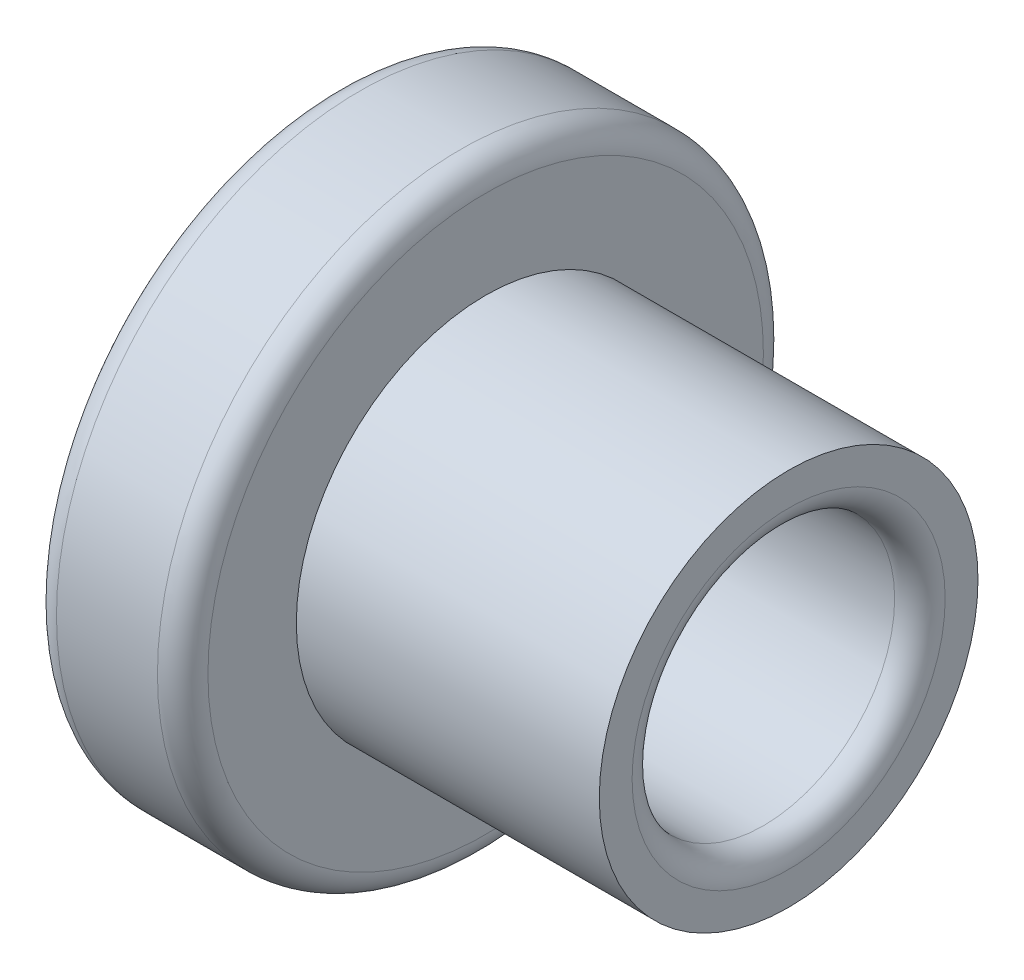
ISO-10303-21;
HEADER;
FILE_DESCRIPTION(('STEP AP214'),'2;1');
FILE_NAME('part.step','',(''),(''),'','','');
FILE_SCHEMA(('AUTOMOTIVE_DESIGN { 1 0 10303 214 1 1 1 1 }'));
ENDSEC;
DATA;
#1=APPLICATION_CONTEXT('core data for automotive mechanical design processes');
#2=APPLICATION_PROTOCOL_DEFINITION('international standard','automotive_design',2000,#1);
#3=PRODUCT_CONTEXT('',#1,'mechanical');
#4=PRODUCT('Part','Part','',(#3));
#5=PRODUCT_RELATED_PRODUCT_CATEGORY('part','',(#4));
#6=PRODUCT_DEFINITION_FORMATION('','',#4);
#7=PRODUCT_DEFINITION_CONTEXT('part definition',#1,'design');
#8=PRODUCT_DEFINITION('design','',#6,#7);
#9=PRODUCT_DEFINITION_SHAPE('','',#8);
#10=(LENGTH_UNIT() NAMED_UNIT(*) SI_UNIT(.MILLI.,.METRE.));
#11=(NAMED_UNIT(*) PLANE_ANGLE_UNIT() SI_UNIT($,.RADIAN.));
#12=(NAMED_UNIT(*) SI_UNIT($,.STERADIAN.) SOLID_ANGLE_UNIT());
#13=UNCERTAINTY_MEASURE_WITH_UNIT(LENGTH_MEASURE(1.E-05),#10,'distance_accuracy_value','');
#14=(GEOMETRIC_REPRESENTATION_CONTEXT(3) GLOBAL_UNCERTAINTY_ASSIGNED_CONTEXT((#13)) GLOBAL_UNIT_ASSIGNED_CONTEXT((#10,
#11,#12)) REPRESENTATION_CONTEXT('',''));
#15=CARTESIAN_POINT('',(0.,0.,0.));
#16=DIRECTION('',(0.,0.,1.));
#17=DIRECTION('',(1.,0.,0.));
#18=AXIS2_PLACEMENT_3D('',#15,#16,#17);
#19=CARTESIAN_POINT('',(3.81,0.,0.));
#20=DIRECTION('',(-1.,0.,0.));
#21=DIRECTION('',(0.,0.,1.));
#22=AXIS2_PLACEMENT_3D('',#19,#20,#21);
#23=CYLINDRICAL_SURFACE('',#22,3.302);
#24=CARTESIAN_POINT('',(10.795,0.,0.));
#25=DIRECTION('',(1.,0.,0.));
#26=DIRECTION('',(0.,0.,-1.));
#27=AXIS2_PLACEMENT_3D('',#24,#25,#26);
#28=CIRCLE('',#27,3.302);
#29=CARTESIAN_POINT('',(10.795,0.,3.302));
#30=VERTEX_POINT('',#29);
#31=EDGE_CURVE('E60',#30,#30,#28,.T.);
#32=CARTESIAN_POINT('',(3.175,0.,0.));
#33=DIRECTION('',(1.,0.,0.));
#34=DIRECTION('',(0.,0.,-1.));
#35=AXIS2_PLACEMENT_3D('',#32,#33,#34);
#36=CIRCLE('',#35,3.302);
#37=CARTESIAN_POINT('',(3.175,0.,3.302));
#38=VERTEX_POINT('',#37);
#39=EDGE_CURVE('E65',#38,#38,#36,.F.);
#40=CARTESIAN_POINT('',(10.795,0.,3.302));
#41=CARTESIAN_POINT('',(10.715625,0.,3.302));
#42=CARTESIAN_POINT('',(10.63625,0.,3.302));
#43=CARTESIAN_POINT('',(10.4775,0.,3.302));
#44=CARTESIAN_POINT('',(10.398125,0.,3.302));
#45=CARTESIAN_POINT('',(10.239375,0.,3.302));
#46=CARTESIAN_POINT('',(10.16,0.,3.302));
#47=CARTESIAN_POINT('',(10.00125,0.,3.302));
#48=CARTESIAN_POINT('',(9.921875,0.,3.302));
#49=CARTESIAN_POINT('',(9.763125,0.,3.302));
#50=CARTESIAN_POINT('',(9.68375,0.,3.302));
#51=CARTESIAN_POINT('',(9.525,0.,3.302));
#52=CARTESIAN_POINT('',(9.445625,0.,3.302));
#53=CARTESIAN_POINT('',(9.286875,0.,3.302));
#54=CARTESIAN_POINT('',(9.2075,0.,3.302));
#55=CARTESIAN_POINT('',(9.04875,0.,3.302));
#56=CARTESIAN_POINT('',(8.969375,0.,3.302));
#57=CARTESIAN_POINT('',(8.810625,0.,3.302));
#58=CARTESIAN_POINT('',(8.73125,0.,3.302));
#59=CARTESIAN_POINT('',(8.5725,0.,3.302));
#60=CARTESIAN_POINT('',(8.493125,0.,3.302));
#61=CARTESIAN_POINT('',(8.334375,0.,3.302));
#62=CARTESIAN_POINT('',(8.255,0.,3.302));
#63=CARTESIAN_POINT('',(8.09625,0.,3.302));
#64=CARTESIAN_POINT('',(8.016875,0.,3.302));
#65=CARTESIAN_POINT('',(7.858125,0.,3.302));
#66=CARTESIAN_POINT('',(7.77875,0.,3.302));
#67=CARTESIAN_POINT('',(7.62,0.,3.302));
#68=CARTESIAN_POINT('',(7.540625,0.,3.302));
#69=CARTESIAN_POINT('',(7.381875,0.,3.302));
#70=CARTESIAN_POINT('',(7.3025,0.,3.302));
#71=CARTESIAN_POINT('',(7.14375,0.,3.302));
#72=CARTESIAN_POINT('',(7.064375,0.,3.302));
#73=CARTESIAN_POINT('',(6.905625,0.,3.302));
#74=CARTESIAN_POINT('',(6.82625,0.,3.302));
#75=CARTESIAN_POINT('',(6.6675,0.,3.302));
#76=CARTESIAN_POINT('',(6.588125,0.,3.302));
#77=CARTESIAN_POINT('',(6.429375,0.,3.302));
#78=CARTESIAN_POINT('',(6.35,0.,3.302));
#79=CARTESIAN_POINT('',(6.19125,0.,3.302));
#80=CARTESIAN_POINT('',(6.111875,0.,3.302));
#81=CARTESIAN_POINT('',(5.953125,0.,3.302));
#82=CARTESIAN_POINT('',(5.87375,0.,3.302));
#83=CARTESIAN_POINT('',(5.715,0.,3.302));
#84=CARTESIAN_POINT('',(5.635625,0.,3.302));
#85=CARTESIAN_POINT('',(5.476875,0.,3.302));
#86=CARTESIAN_POINT('',(5.3975,0.,3.302));
#87=CARTESIAN_POINT('',(5.23875,0.,3.302));
#88=CARTESIAN_POINT('',(5.159375,0.,3.302));
#89=CARTESIAN_POINT('',(5.000625,0.,3.302));
#90=CARTESIAN_POINT('',(4.92125,0.,3.302));
#91=CARTESIAN_POINT('',(4.7625,0.,3.302));
#92=CARTESIAN_POINT('',(4.683125,0.,3.302));
#93=CARTESIAN_POINT('',(4.524375,0.,3.302));
#94=CARTESIAN_POINT('',(4.445,0.,3.302));
#95=CARTESIAN_POINT('',(4.28625,0.,3.302));
#96=CARTESIAN_POINT('',(4.206875,0.,3.302));
#97=CARTESIAN_POINT('',(4.048125,0.,3.302));
#98=CARTESIAN_POINT('',(3.96875,0.,3.302));
#99=CARTESIAN_POINT('',(3.81,0.,3.302));
#100=CARTESIAN_POINT('',(3.730625,0.,3.302));
#101=CARTESIAN_POINT('',(3.571875,0.,3.302));
#102=CARTESIAN_POINT('',(3.4925,0.,3.302));
#103=CARTESIAN_POINT('',(3.33375,0.,3.302));
#104=CARTESIAN_POINT('',(3.254375,0.,3.302));
#105=CARTESIAN_POINT('',(3.175,0.,3.302));
#106=B_SPLINE_CURVE_WITH_KNOTS('',3,(#40,#41,#42,#43,#44,#45,#46,#47,#48,#49,#50,#51,#52,#53,
#54,#55,#56,#57,#58,#59,#60,#61,#62,#63,#64,#65,#66,#67,#68,#69,#70,#71,#72,#73,#74,#75,#76,#77,
#78,#79,#80,#81,#82,#83,#84,#85,#86,#87,#88,#89,#90,#91,#92,#93,#94,#95,#96,#97,#98,#99,#100,
#101,#102,#103,#104,#105),.UNSPECIFIED.,.F.,.F.,(4,2,2,2,2,2,2,2,2,2,2,2,2,2,2,2,2,2,2,2,2,2,2,
2,2,2,2,2,2,2,2,2,4),(0.,0.238125,0.476250000000001,0.714375,0.9525,1.190625,1.42875,1.666875,
1.905,2.143125,2.38125,2.619375,2.8575,3.095625,3.33375,3.571875,3.81,4.048125,4.28625,4.524375,
4.7625,5.000625,5.23875,5.476875,5.715,5.953125,6.19125,6.429375,6.6675,6.905625,7.14375,
7.381875,7.62),.UNSPECIFIED.);
#107=EDGE_CURVE('BSEAM52',#30,#38,#106,.T.);
#108=ORIENTED_EDGE('',*,*,#31,.T.);
#109=ORIENTED_EDGE('',*,*,#39,.T.);
#110=ORIENTED_EDGE('',*,*,#107,.T.);
#111=ORIENTED_EDGE('',*,*,#107,.F.);
#112=EDGE_LOOP('',(#108,#110,#109,#111));
#113=FACE_BOUND('',#112,.T.);
#114=ADVANCED_FACE('F52',(#113),#23,.F.);
#115=CARTESIAN_POINT('',(14.605,0.,0.));
#116=DIRECTION('',(-1.,0.,0.));
#117=DIRECTION('',(0.,0.,1.));
#118=AXIS2_PLACEMENT_3D('',#115,#116,#117);
#119=CYLINDRICAL_SURFACE('',#118,4.7625);
#120=CARTESIAN_POINT('',(3.81,0.,0.));
#121=DIRECTION('',(1.,0.,0.));
#122=DIRECTION('',(0.,0.,-1.));
#123=AXIS2_PLACEMENT_3D('',#120,#121,#122);
#124=CIRCLE('',#123,4.7625);
#125=CARTESIAN_POINT('',(3.81,0.,-4.7625));
#126=VERTEX_POINT('',#125);
#127=EDGE_CURVE('E92',#126,#126,#124,.T.);
#128=ORIENTED_EDGE('',*,*,#127,.T.);
#129=EDGE_LOOP('',(#128));
#130=FACE_BOUND('',#129,.T.);
#131=CARTESIAN_POINT('',(11.43,0.,0.));
#132=DIRECTION('',(1.,0.,0.));
#133=DIRECTION('',(0.,0.,-1.));
#134=AXIS2_PLACEMENT_3D('',#131,#132,#133);
#135=CIRCLE('',#134,4.7625);
#136=CARTESIAN_POINT('',(11.43,0.,-4.7625));
#137=VERTEX_POINT('',#136);
#138=EDGE_CURVE('E96',#137,#137,#135,.F.);
#139=ORIENTED_EDGE('',*,*,#138,.T.);
#140=EDGE_LOOP('',(#139));
#141=FACE_BOUND('',#140,.T.);
#142=ADVANCED_FACE('F101',(#130,#141),#119,.T.);
#143=CARTESIAN_POINT('',(3.81,0.,0.));
#144=DIRECTION('',(1.,0.,0.));
#145=DIRECTION('',(0.,0.,-1.));
#146=AXIS2_PLACEMENT_3D('',#143,#144,#145);
#147=PLANE('',#146);
#148=CARTESIAN_POINT('',(3.81,0.,0.));
#149=DIRECTION('',(1.,0.,0.));
#150=DIRECTION('',(0.,0.,-1.));
#151=AXIS2_PLACEMENT_3D('',#148,#149,#150);
#152=CIRCLE('',#151,6.985);
#153=CARTESIAN_POINT('',(3.81,0.,-6.985));
#154=VERTEX_POINT('',#153);
#155=EDGE_CURVE('E76',#154,#154,#152,.T.);
#156=ORIENTED_EDGE('',*,*,#155,.T.);
#157=EDGE_LOOP('',(#156));
#158=FACE_BOUND('',#157,.T.);
#159=ORIENTED_EDGE('',*,*,#127,.F.);
#160=EDGE_LOOP('',(#159));
#161=FACE_BOUND('',#160,.T.);
#162=ADVANCED_FACE('F120',(#158,#161),#147,.T.);
#163=CARTESIAN_POINT('',(0.,0.,0.));
#164=DIRECTION('',(1.,0.,0.));
#165=DIRECTION('',(0.,0.,-1.));
#166=AXIS2_PLACEMENT_3D('',#163,#164,#165);
#167=PLANE('',#166);
#168=CARTESIAN_POINT('',(0.,0.,0.));
#169=DIRECTION('',(1.,0.,0.));
#170=DIRECTION('',(0.,0.,-1.));
#171=AXIS2_PLACEMENT_3D('',#168,#169,#170);
#172=CIRCLE('',#171,6.9544196929267);
#173=CARTESIAN_POINT('',(0.,0.,-6.9544196929267));
#174=VERTEX_POINT('',#173);
#175=EDGE_CURVE('E70',#174,#174,#172,.T.);
#176=ORIENTED_EDGE('',*,*,#175,.T.);
#177=EDGE_LOOP('',(#176));
#178=FACE_BOUND('',#177,.T.);
#179=CARTESIAN_POINT('',(0.,0.,0.));
#180=DIRECTION('',(1.,0.,0.));
#181=DIRECTION('',(0.,0.,-1.));
#182=AXIS2_PLACEMENT_3D('',#179,#180,#181);
#183=CIRCLE('',#182,6.985);
#184=CARTESIAN_POINT('',(0.,0.,-6.985));
#185=VERTEX_POINT('',#184);
#186=EDGE_CURVE('E80',#185,#185,#183,.F.);
#187=ORIENTED_EDGE('',*,*,#186,.T.);
#188=EDGE_LOOP('',(#187));
#189=FACE_BOUND('',#188,.T.);
#190=ADVANCED_FACE('F126',(#178,#189),#167,.F.);
#191=CARTESIAN_POINT('',(3.81,0.,0.));
#192=DIRECTION('',(-1.,0.,0.));
#193=DIRECTION('',(0.,0.,1.));
#194=AXIS2_PLACEMENT_3D('',#191,#192,#193);
#195=CYLINDRICAL_SURFACE('',#194,7.62);
#196=CARTESIAN_POINT('',(0.635,0.,0.));
#197=DIRECTION('',(1.,0.,0.));
#198=DIRECTION('',(0.,0.,-1.));
#199=AXIS2_PLACEMENT_3D('',#196,#197,#198);
#200=CIRCLE('',#199,7.62);
#201=CARTESIAN_POINT('',(0.635,0.,7.62));
#202=VERTEX_POINT('',#201);
#203=EDGE_CURVE('E84',#202,#202,#200,.T.);
#204=CARTESIAN_POINT('',(3.175,0.,0.));
#205=DIRECTION('',(1.,0.,0.));
#206=DIRECTION('',(0.,0.,-1.));
#207=AXIS2_PLACEMENT_3D('',#204,#205,#206);
#208=CIRCLE('',#207,7.62);
#209=CARTESIAN_POINT('',(3.175,0.,7.62));
#210=VERTEX_POINT('',#209);
#211=EDGE_CURVE('E88',#210,#210,#208,.F.);
#212=CARTESIAN_POINT('',(0.635,0.,7.62));
#213=CARTESIAN_POINT('',(0.661458333333333,0.,7.62));
#214=CARTESIAN_POINT('',(0.687916666666667,0.,7.62));
#215=CARTESIAN_POINT('',(0.740833333333333,0.,7.62));
#216=CARTESIAN_POINT('',(0.767291666666667,0.,7.62));
#217=CARTESIAN_POINT('',(0.820208333333334,0.,7.62));
#218=CARTESIAN_POINT('',(0.846666666666667,0.,7.62));
#219=CARTESIAN_POINT('',(0.899583333333334,0.,7.62));
#220=CARTESIAN_POINT('',(0.926041666666667,0.,7.62));
#221=CARTESIAN_POINT('',(0.978958333333334,0.,7.62));
#222=CARTESIAN_POINT('',(1.00541666666667,0.,7.62));
#223=CARTESIAN_POINT('',(1.05833333333333,0.,7.62));
#224=CARTESIAN_POINT('',(1.08479166666667,0.,7.62));
#225=CARTESIAN_POINT('',(1.13770833333333,0.,7.62));
#226=CARTESIAN_POINT('',(1.16416666666667,0.,7.62));
#227=CARTESIAN_POINT('',(1.21708333333333,0.,7.62));
#228=CARTESIAN_POINT('',(1.24354166666667,0.,7.62));
#229=CARTESIAN_POINT('',(1.29645833333333,0.,7.62));
#230=CARTESIAN_POINT('',(1.32291666666667,0.,7.62));
#231=CARTESIAN_POINT('',(1.37583333333333,0.,7.62));
#232=CARTESIAN_POINT('',(1.40229166666667,0.,7.62));
#233=CARTESIAN_POINT('',(1.45520833333333,0.,7.62));
#234=CARTESIAN_POINT('',(1.48166666666667,0.,7.62));
#235=CARTESIAN_POINT('',(1.53458333333333,0.,7.62));
#236=CARTESIAN_POINT('',(1.56104166666667,0.,7.62));
#237=CARTESIAN_POINT('',(1.61395833333333,0.,7.62));
#238=CARTESIAN_POINT('',(1.64041666666667,0.,7.62));
#239=CARTESIAN_POINT('',(1.69333333333333,0.,7.62));
#240=CARTESIAN_POINT('',(1.71979166666667,0.,7.62));
#241=CARTESIAN_POINT('',(1.77270833333333,0.,7.62));
#242=CARTESIAN_POINT('',(1.79916666666667,0.,7.62));
#243=CARTESIAN_POINT('',(1.85208333333333,0.,7.62));
#244=CARTESIAN_POINT('',(1.87854166666667,0.,7.62));
#245=CARTESIAN_POINT('',(1.93145833333333,0.,7.62));
#246=CARTESIAN_POINT('',(1.95791666666667,0.,7.62));
#247=CARTESIAN_POINT('',(2.01083333333333,0.,7.62));
#248=CARTESIAN_POINT('',(2.03729166666667,0.,7.62));
#249=CARTESIAN_POINT('',(2.09020833333333,0.,7.62));
#250=CARTESIAN_POINT('',(2.11666666666667,0.,7.62));
#251=CARTESIAN_POINT('',(2.16958333333333,0.,7.62));
#252=CARTESIAN_POINT('',(2.19604166666667,0.,7.62));
#253=CARTESIAN_POINT('',(2.24895833333333,0.,7.62));
#254=CARTESIAN_POINT('',(2.27541666666667,0.,7.62));
#255=CARTESIAN_POINT('',(2.32833333333333,0.,7.62));
#256=CARTESIAN_POINT('',(2.35479166666667,0.,7.62));
#257=CARTESIAN_POINT('',(2.40770833333333,0.,7.62));
#258=CARTESIAN_POINT('',(2.43416666666667,0.,7.62));
#259=CARTESIAN_POINT('',(2.48708333333333,0.,7.62));
#260=CARTESIAN_POINT('',(2.51354166666667,0.,7.62));
#261=CARTESIAN_POINT('',(2.56645833333333,0.,7.62));
#262=CARTESIAN_POINT('',(2.59291666666667,0.,7.62));
#263=CARTESIAN_POINT('',(2.64583333333333,0.,7.62));
#264=CARTESIAN_POINT('',(2.67229166666667,0.,7.62));
#265=CARTESIAN_POINT('',(2.72520833333333,0.,7.62));
#266=CARTESIAN_POINT('',(2.75166666666667,0.,7.62));
#267=CARTESIAN_POINT('',(2.80458333333333,0.,7.62));
#268=CARTESIAN_POINT('',(2.83104166666667,0.,7.62));
#269=CARTESIAN_POINT('',(2.88395833333333,0.,7.62));
#270=CARTESIAN_POINT('',(2.91041666666667,0.,7.62));
#271=CARTESIAN_POINT('',(2.96333333333333,0.,7.62));
#272=CARTESIAN_POINT('',(2.98979166666667,0.,7.62));
#273=CARTESIAN_POINT('',(3.04270833333333,0.,7.62));
#274=CARTESIAN_POINT('',(3.06916666666667,0.,7.62));
#275=CARTESIAN_POINT('',(3.12208333333333,0.,7.62));
#276=CARTESIAN_POINT('',(3.14854166666667,0.,7.62));
#277=CARTESIAN_POINT('',(3.175,0.,7.62));
#278=B_SPLINE_CURVE_WITH_KNOTS('',3,(#212,#213,#214,#215,#216,#217,#218,#219,#220,#221,#222,
#223,#224,#225,#226,#227,#228,#229,#230,#231,#232,#233,#234,#235,#236,#237,#238,#239,#240,#241,
#242,#243,#244,#245,#246,#247,#248,#249,#250,#251,#252,#253,#254,#255,#256,#257,#258,#259,#260,
#261,#262,#263,#264,#265,#266,#267,#268,#269,#270,#271,#272,#273,#274,#275,#276,#277),
.UNSPECIFIED.,.F.,.F.,(4,2,2,2,2,2,2,2,2,2,2,2,2,2,2,2,2,2,2,2,2,2,2,2,2,2,2,2,2,2,2,2,4),(0.,
0.079375,0.15875,0.238125,0.3175,0.396875,0.47625,0.555625,0.635,0.714375,0.79375,0.873125,
0.9525,1.031875,1.11125,1.190625,1.27,1.349375,1.42875,1.508125,1.5875,1.666875,1.74625,
1.825625,1.905,1.984375,2.06375,2.143125,2.2225,2.301875,2.38125,2.460625,2.54),.UNSPECIFIED.);
#279=EDGE_CURVE('BSEAM130',#202,#210,#278,.T.);
#280=ORIENTED_EDGE('',*,*,#203,.T.);
#281=ORIENTED_EDGE('',*,*,#211,.T.);
#282=ORIENTED_EDGE('',*,*,#279,.T.);
#283=ORIENTED_EDGE('',*,*,#279,.F.);
#284=EDGE_LOOP('',(#280,#282,#281,#283));
#285=FACE_BOUND('',#284,.T.);
#286=ADVANCED_FACE('F130',(#285),#195,.T.);
#287=CARTESIAN_POINT('',(0.635,0.,0.));
#288=DIRECTION('',(1.,0.,0.));
#289=DIRECTION('',(0.,0.,-1.));
#290=AXIS2_PLACEMENT_3D('',#287,#288,#289);
#291=TOROIDAL_SURFACE('',#290,6.985,0.635);
#292=ORIENTED_EDGE('',*,*,#186,.F.);
#293=EDGE_LOOP('',(#292));
#294=FACE_BOUND('',#293,.T.);
#295=ORIENTED_EDGE('',*,*,#203,.F.);
#296=EDGE_LOOP('',(#295));
#297=FACE_BOUND('',#296,.T.);
#298=ADVANCED_FACE('F134',(#294,#297),#291,.T.);
#299=CARTESIAN_POINT('',(3.175,0.,0.));
#300=DIRECTION('',(1.,0.,0.));
#301=DIRECTION('',(0.,0.,-1.));
#302=AXIS2_PLACEMENT_3D('',#299,#300,#301);
#303=TOROIDAL_SURFACE('',#302,6.985,0.635);
#304=ORIENTED_EDGE('',*,*,#211,.F.);
#305=EDGE_LOOP('',(#304));
#306=FACE_BOUND('',#305,.T.);
#307=ORIENTED_EDGE('',*,*,#155,.F.);
#308=EDGE_LOOP('',(#307));
#309=FACE_BOUND('',#308,.T.);
#310=ADVANCED_FACE('F112',(#306,#309),#303,.T.);
#311=CARTESIAN_POINT('',(0.,0.,0.));
#312=DIRECTION('',(-1.,0.,0.));
#313=DIRECTION('',(0.,0.,1.));
#314=AXIS2_PLACEMENT_3D('',#311,#312,#313);
#315=CONICAL_SURFACE('',#314,6.9544196929267,0.85521133347722);
#316=ORIENTED_EDGE('',*,*,#39,.F.);
#317=EDGE_LOOP('',(#316));
#318=FACE_BOUND('',#317,.T.);
#319=ORIENTED_EDGE('',*,*,#175,.F.);
#320=EDGE_LOOP('',(#319));
#321=FACE_BOUND('',#320,.T.);
#322=ADVANCED_FACE('F105',(#318,#321),#315,.F.);
#323=CARTESIAN_POINT('',(11.43,0.,0.));
#324=DIRECTION('',(1.,0.,0.));
#325=DIRECTION('',(0.,0.,-1.));
#326=AXIS2_PLACEMENT_3D('',#323,#324,#325);
#327=PLANE('',#326);
#328=CARTESIAN_POINT('',(11.43,0.,0.));
#329=DIRECTION('',(1.,0.,0.));
#330=DIRECTION('',(0.,0.,-1.));
#331=AXIS2_PLACEMENT_3D('',#328,#329,#330);
#332=CIRCLE('',#331,3.937);
#333=CARTESIAN_POINT('',(11.43,0.,-3.937));
#334=VERTEX_POINT('',#333);
#335=EDGE_CURVE('E13',#334,#334,#332,.F.);
#336=ORIENTED_EDGE('',*,*,#335,.T.);
#337=EDGE_LOOP('',(#336));
#338=FACE_BOUND('',#337,.T.);
#339=ORIENTED_EDGE('',*,*,#138,.F.);
#340=EDGE_LOOP('',(#339));
#341=FACE_BOUND('',#340,.T.);
#342=ADVANCED_FACE('F103',(#338,#341),#327,.T.);
#343=CARTESIAN_POINT('',(10.795,0.,0.));
#344=DIRECTION('',(1.,0.,0.));
#345=DIRECTION('',(0.,0.,-1.));
#346=AXIS2_PLACEMENT_3D('',#343,#344,#345);
#347=TOROIDAL_SURFACE('',#346,3.937,0.635);
#348=ORIENTED_EDGE('',*,*,#335,.F.);
#349=EDGE_LOOP('',(#348));
#350=FACE_BOUND('',#349,.T.);
#351=ORIENTED_EDGE('',*,*,#31,.F.);
#352=EDGE_LOOP('',(#351));
#353=FACE_BOUND('',#352,.T.);
#354=ADVANCED_FACE('F54',(#350,#353),#347,.T.);
#355=CLOSED_SHELL('',(#114,#142,#162,#190,#286,#298,#310,#322,#342,#354));
#356=MANIFOLD_SOLID_BREP('B2',#355);
#357=ADVANCED_BREP_SHAPE_REPRESENTATION('',(#18,#356),#14);
#358=SHAPE_DEFINITION_REPRESENTATION(#9,#357);
ENDSEC;
END-ISO-10303-21;
